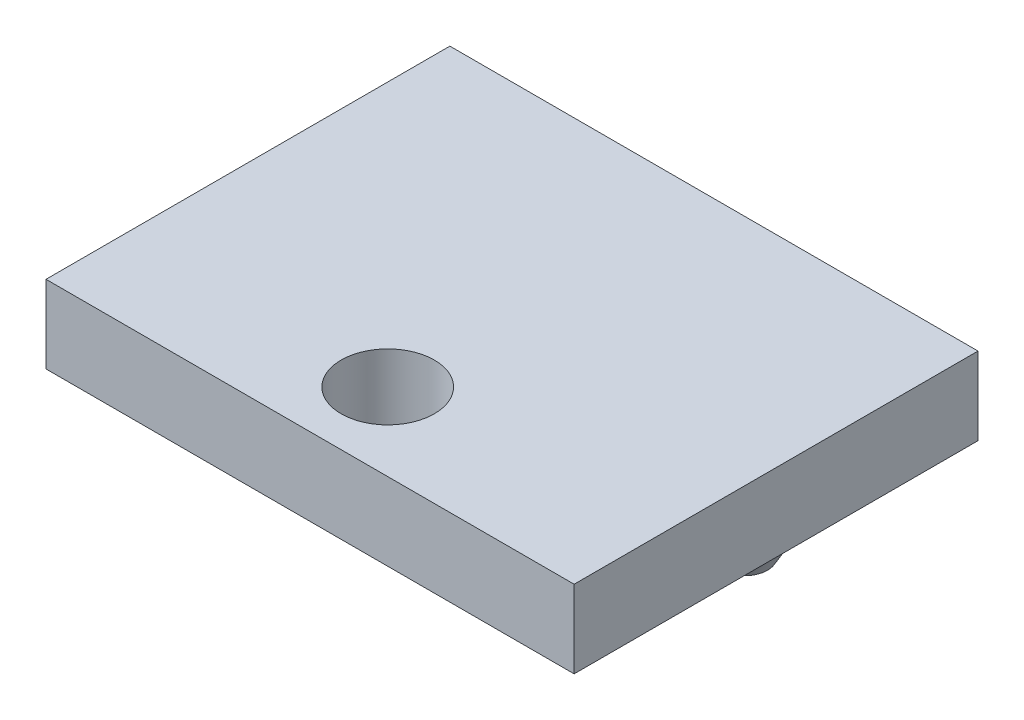
ISO-10303-21;
HEADER;
FILE_DESCRIPTION(('STEP AP214'),'2;1');
FILE_NAME('part.step','',(''),(''),'','','');
FILE_SCHEMA(('AUTOMOTIVE_DESIGN { 1 0 10303 214 1 1 1 1 }'));
ENDSEC;
DATA;
#1=APPLICATION_CONTEXT('core data for automotive mechanical design processes');
#2=APPLICATION_PROTOCOL_DEFINITION('international standard','automotive_design',2000,#1);
#3=PRODUCT_CONTEXT('',#1,'mechanical');
#4=PRODUCT('Part','Part','',(#3));
#5=PRODUCT_RELATED_PRODUCT_CATEGORY('part','',(#4));
#6=PRODUCT_DEFINITION_FORMATION('','',#4);
#7=PRODUCT_DEFINITION_CONTEXT('part definition',#1,'design');
#8=PRODUCT_DEFINITION('design','',#6,#7);
#9=PRODUCT_DEFINITION_SHAPE('','',#8);
#10=(LENGTH_UNIT() NAMED_UNIT(*) SI_UNIT(.MILLI.,.METRE.));
#11=(NAMED_UNIT(*) PLANE_ANGLE_UNIT() SI_UNIT($,.RADIAN.));
#12=(NAMED_UNIT(*) SI_UNIT($,.STERADIAN.) SOLID_ANGLE_UNIT());
#13=UNCERTAINTY_MEASURE_WITH_UNIT(LENGTH_MEASURE(1.E-05),#10,'distance_accuracy_value','');
#14=(GEOMETRIC_REPRESENTATION_CONTEXT(3) GLOBAL_UNCERTAINTY_ASSIGNED_CONTEXT((#13)) GLOBAL_UNIT_ASSIGNED_CONTEXT((#10,
#11,#12)) REPRESENTATION_CONTEXT('',''));
#15=CARTESIAN_POINT('',(0.,0.,0.));
#16=DIRECTION('',(0.,0.,1.));
#17=DIRECTION('',(1.,0.,0.));
#18=AXIS2_PLACEMENT_3D('',#15,#16,#17);
#19=CARTESIAN_POINT('',(-10.,-6.,0.));
#20=DIRECTION('',(0.,1.,0.));
#21=DIRECTION('',(0.,0.,1.));
#22=AXIS2_PLACEMENT_3D('',#19,#20,#21);
#23=CYLINDRICAL_SURFACE('',#22,2.45);
#24=CARTESIAN_POINT('',(-10.,-4.26794919243112,0.));
#25=DIRECTION('',(0.,1.,0.));
#26=DIRECTION('',(0.,0.,1.));
#27=AXIS2_PLACEMENT_3D('',#24,#25,#26);
#28=CIRCLE('',#27,2.45);
#29=CARTESIAN_POINT('',(-10.,-4.26794919243112,2.45));
#30=VERTEX_POINT('',#29);
#31=EDGE_CURVE('E54',#30,#30,#28,.T.);
#32=ORIENTED_EDGE('',*,*,#31,.T.);
#33=EDGE_LOOP('',(#32));
#34=FACE_BOUND('',#33,.T.);
#35=CARTESIAN_POINT('',(-10.,0.,0.));
#36=DIRECTION('',(0.,1.,0.));
#37=DIRECTION('',(0.,0.,1.));
#38=AXIS2_PLACEMENT_3D('',#35,#36,#37);
#39=CIRCLE('',#38,2.45);
#40=CARTESIAN_POINT('',(-10.,0.,2.45));
#41=VERTEX_POINT('',#40);
#42=EDGE_CURVE('E134',#41,#41,#39,.T.);
#43=ORIENTED_EDGE('',*,*,#42,.F.);
#44=EDGE_LOOP('',(#43));
#45=FACE_BOUND('',#44,.T.);
#46=ADVANCED_FACE('F43',(#34,#45),#23,.T.);
#47=CARTESIAN_POINT('',(0.,-6.,0.));
#48=DIRECTION('',(0.,1.,0.));
#49=DIRECTION('',(0.,0.,1.));
#50=AXIS2_PLACEMENT_3D('',#47,#48,#49);
#51=PLANE('',#50);
#52=CARTESIAN_POINT('',(-10.,-6.,0.));
#53=DIRECTION('',(0.,1.,0.));
#54=DIRECTION('',(0.,0.,1.));
#55=AXIS2_PLACEMENT_3D('',#52,#53,#54);
#56=CIRCLE('',#55,1.45);
#57=CARTESIAN_POINT('',(-10.,-6.,1.45));
#58=VERTEX_POINT('',#57);
#59=EDGE_CURVE('E11',#58,#58,#56,.F.);
#60=ORIENTED_EDGE('',*,*,#59,.T.);
#61=EDGE_LOOP('',(#60));
#62=FACE_BOUND('',#61,.T.);
#63=ADVANCED_FACE('F145',(#62),#51,.F.);
#64=CARTESIAN_POINT('',(-10.,-4.26794919243112,0.));
#65=DIRECTION('',(0.,1.,0.));
#66=DIRECTION('',(0.,0.,1.));
#67=AXIS2_PLACEMENT_3D('',#64,#65,#66);
#68=CONICAL_SURFACE('',#67,2.45,0.5235987755983);
#69=ORIENTED_EDGE('',*,*,#59,.F.);
#70=EDGE_LOOP('',(#69));
#71=FACE_BOUND('',#70,.T.);
#72=ORIENTED_EDGE('',*,*,#31,.F.);
#73=EDGE_LOOP('',(#72));
#74=FACE_BOUND('',#73,.T.);
#75=ADVANCED_FACE('F46',(#71,#74),#68,.T.);
#76=CARTESIAN_POINT('',(17.,5.,-8.));
#77=DIRECTION('',(-1.,0.,0.));
#78=DIRECTION('',(0.,0.,1.));
#79=AXIS2_PLACEMENT_3D('',#76,#77,#78);
#80=PLANE('',#79);
#81=DIRECTION('',(0.,0.,-1.));
#82=VECTOR('',#81,1.);
#83=CARTESIAN_POINT('',(17.,0.,-8.));
#84=LINE('',#83,#82);
#85=CARTESIAN_POINT('',(17.,0.,18.));
#86=VERTEX_POINT('',#85);
#87=CARTESIAN_POINT('',(17.,0.,-8.));
#88=VERTEX_POINT('',#87);
#89=EDGE_CURVE('E117',#86,#88,#84,.T.);
#90=ORIENTED_EDGE('',*,*,#89,.T.);
#91=DIRECTION('',(0.,-1.,0.));
#92=VECTOR('',#91,1.);
#93=CARTESIAN_POINT('',(17.,5.,-8.));
#94=LINE('',#93,#92);
#95=CARTESIAN_POINT('',(17.,5.,-8.));
#96=VERTEX_POINT('',#95);
#97=EDGE_CURVE('E106',#96,#88,#94,.T.);
#98=ORIENTED_EDGE('',*,*,#97,.F.);
#99=DIRECTION('',(0.,0.,-1.));
#100=VECTOR('',#99,1.);
#101=CARTESIAN_POINT('',(17.,5.,-8.));
#102=LINE('',#101,#100);
#103=CARTESIAN_POINT('',(17.,5.,18.));
#104=VERTEX_POINT('',#103);
#105=EDGE_CURVE('E98',#104,#96,#102,.T.);
#106=ORIENTED_EDGE('',*,*,#105,.F.);
#107=DIRECTION('',(0.,-1.,0.));
#108=VECTOR('',#107,1.);
#109=CARTESIAN_POINT('',(17.,5.,18.));
#110=LINE('',#109,#108);
#111=EDGE_CURVE('E113',#104,#86,#110,.T.);
#112=ORIENTED_EDGE('',*,*,#111,.T.);
#113=EDGE_LOOP('',(#90,#98,#106,#112));
#114=FACE_BOUND('',#113,.T.);
#115=ADVANCED_FACE('F144',(#114),#80,.F.);
#116=CARTESIAN_POINT('',(-17.,5.,-8.));
#117=DIRECTION('',(0.,0.,1.));
#118=DIRECTION('',(1.,0.,0.));
#119=AXIS2_PLACEMENT_3D('',#116,#117,#118);
#120=PLANE('',#119);
#121=DIRECTION('',(-1.,0.,0.));
#122=VECTOR('',#121,1.);
#123=CARTESIAN_POINT('',(-17.,0.,-8.));
#124=LINE('',#123,#122);
#125=CARTESIAN_POINT('',(-17.,0.,-8.));
#126=VERTEX_POINT('',#125);
#127=EDGE_CURVE('E104',#88,#126,#124,.T.);
#128=ORIENTED_EDGE('',*,*,#127,.T.);
#129=DIRECTION('',(0.,-1.,0.));
#130=VECTOR('',#129,1.);
#131=CARTESIAN_POINT('',(-17.,5.,-8.));
#132=LINE('',#131,#130);
#133=CARTESIAN_POINT('',(-17.,5.,-8.));
#134=VERTEX_POINT('',#133);
#135=EDGE_CURVE('E102',#134,#126,#132,.T.);
#136=ORIENTED_EDGE('',*,*,#135,.F.);
#137=DIRECTION('',(-1.,0.,0.));
#138=VECTOR('',#137,1.);
#139=CARTESIAN_POINT('',(-17.,5.,-8.));
#140=LINE('',#139,#138);
#141=EDGE_CURVE('E93',#96,#134,#140,.T.);
#142=ORIENTED_EDGE('',*,*,#141,.F.);
#143=ORIENTED_EDGE('',*,*,#97,.T.);
#144=EDGE_LOOP('',(#128,#136,#142,#143));
#145=FACE_BOUND('',#144,.T.);
#146=ADVANCED_FACE('F103',(#145),#120,.F.);
#147=CARTESIAN_POINT('',(-17.,5.,-8.));
#148=DIRECTION('',(1.,0.,0.));
#149=DIRECTION('',(0.,0.,-1.));
#150=AXIS2_PLACEMENT_3D('',#147,#148,#149);
#151=PLANE('',#150);
#152=DIRECTION('',(0.,0.,1.));
#153=VECTOR('',#152,1.);
#154=CARTESIAN_POINT('',(-17.,0.,-8.));
#155=LINE('',#154,#153);
#156=CARTESIAN_POINT('',(-17.,0.,18.));
#157=VERTEX_POINT('',#156);
#158=EDGE_CURVE('E79',#126,#157,#155,.T.);
#159=ORIENTED_EDGE('',*,*,#158,.T.);
#160=DIRECTION('',(0.,-1.,0.));
#161=VECTOR('',#160,1.);
#162=CARTESIAN_POINT('',(-17.,5.,18.));
#163=LINE('',#162,#161);
#164=CARTESIAN_POINT('',(-17.,5.,18.));
#165=VERTEX_POINT('',#164);
#166=EDGE_CURVE('E107',#165,#157,#163,.T.);
#167=ORIENTED_EDGE('',*,*,#166,.F.);
#168=DIRECTION('',(0.,0.,1.));
#169=VECTOR('',#168,1.);
#170=CARTESIAN_POINT('',(-17.,5.,-8.));
#171=LINE('',#170,#169);
#172=EDGE_CURVE('E96',#134,#165,#171,.T.);
#173=ORIENTED_EDGE('',*,*,#172,.F.);
#174=ORIENTED_EDGE('',*,*,#135,.T.);
#175=EDGE_LOOP('',(#159,#167,#173,#174));
#176=FACE_BOUND('',#175,.T.);
#177=ADVANCED_FACE('F109',(#176),#151,.F.);
#178=CARTESIAN_POINT('',(-17.,5.,18.));
#179=DIRECTION('',(0.,0.,-1.));
#180=DIRECTION('',(-1.,0.,0.));
#181=AXIS2_PLACEMENT_3D('',#178,#179,#180);
#182=PLANE('',#181);
#183=DIRECTION('',(1.,0.,0.));
#184=VECTOR('',#183,1.);
#185=CARTESIAN_POINT('',(-17.,0.,18.));
#186=LINE('',#185,#184);
#187=EDGE_CURVE('E85',#157,#86,#186,.T.);
#188=ORIENTED_EDGE('',*,*,#187,.T.);
#189=ORIENTED_EDGE('',*,*,#111,.F.);
#190=DIRECTION('',(1.,0.,0.));
#191=VECTOR('',#190,1.);
#192=CARTESIAN_POINT('',(-17.,5.,18.));
#193=LINE('',#192,#191);
#194=EDGE_CURVE('E62',#165,#104,#193,.T.);
#195=ORIENTED_EDGE('',*,*,#194,.F.);
#196=ORIENTED_EDGE('',*,*,#166,.T.);
#197=EDGE_LOOP('',(#188,#189,#195,#196));
#198=FACE_BOUND('',#197,.T.);
#199=ADVANCED_FACE('F164',(#198),#182,.F.);
#200=CARTESIAN_POINT('',(0.,5.,0.));
#201=DIRECTION('',(0.,1.,0.));
#202=DIRECTION('',(0.,0.,1.));
#203=AXIS2_PLACEMENT_3D('',#200,#201,#202);
#204=PLANE('',#203);
#205=CARTESIAN_POINT('',(0.,5.,13.));
#206=DIRECTION('',(0.,-1.,0.));
#207=DIRECTION('',(0.,0.,-1.));
#208=AXIS2_PLACEMENT_3D('',#205,#206,#207);
#209=CIRCLE('',#208,3.);
#210=CARTESIAN_POINT('',(0.,5.,10.));
#211=VERTEX_POINT('',#210);
#212=EDGE_CURVE('E197',#211,#211,#209,.T.);
#213=ORIENTED_EDGE('',*,*,#212,.T.);
#214=EDGE_LOOP('',(#213));
#215=FACE_BOUND('',#214,.T.);
#216=ORIENTED_EDGE('',*,*,#105,.T.);
#217=ORIENTED_EDGE('',*,*,#141,.T.);
#218=ORIENTED_EDGE('',*,*,#172,.T.);
#219=ORIENTED_EDGE('',*,*,#194,.T.);
#220=EDGE_LOOP('',(#216,#217,#218,#219));
#221=FACE_BOUND('',#220,.T.);
#222=ADVANCED_FACE('F94',(#215,#221),#204,.T.);
#223=CARTESIAN_POINT('',(0.,0.,0.));
#224=DIRECTION('',(0.,1.,0.));
#225=DIRECTION('',(0.,0.,1.));
#226=AXIS2_PLACEMENT_3D('',#223,#224,#225);
#227=PLANE('',#226);
#228=CARTESIAN_POINT('',(0.,0.,13.));
#229=DIRECTION('',(0.,-1.,0.));
#230=DIRECTION('',(0.,0.,-1.));
#231=AXIS2_PLACEMENT_3D('',#228,#229,#230);
#232=CIRCLE('',#231,3.);
#233=CARTESIAN_POINT('',(0.,0.,10.));
#234=VERTEX_POINT('',#233);
#235=EDGE_CURVE('E200',#234,#234,#232,.T.);
#236=ORIENTED_EDGE('',*,*,#235,.F.);
#237=EDGE_LOOP('',(#236));
#238=FACE_BOUND('',#237,.T.);
#239=CARTESIAN_POINT('',(10.,0.,0.));
#240=DIRECTION('',(0.,1.,0.));
#241=DIRECTION('',(0.,0.,1.));
#242=AXIS2_PLACEMENT_3D('',#239,#240,#241);
#243=CIRCLE('',#242,2.45);
#244=CARTESIAN_POINT('',(10.,0.,2.45));
#245=VERTEX_POINT('',#244);
#246=EDGE_CURVE('E204',#245,#245,#243,.T.);
#247=ORIENTED_EDGE('',*,*,#246,.T.);
#248=EDGE_LOOP('',(#247));
#249=FACE_BOUND('',#248,.T.);
#250=ORIENTED_EDGE('',*,*,#42,.T.);
#251=EDGE_LOOP('',(#250));
#252=FACE_BOUND('',#251,.T.);
#253=ORIENTED_EDGE('',*,*,#89,.F.);
#254=ORIENTED_EDGE('',*,*,#187,.F.);
#255=ORIENTED_EDGE('',*,*,#158,.F.);
#256=ORIENTED_EDGE('',*,*,#127,.F.);
#257=EDGE_LOOP('',(#253,#254,#255,#256));
#258=FACE_BOUND('',#257,.T.);
#259=ADVANCED_FACE('F167',(#238,#249,#252,#258),#227,.F.);
#260=CARTESIAN_POINT('',(10.,-6.,0.));
#261=DIRECTION('',(0.,1.,0.));
#262=DIRECTION('',(0.,0.,1.));
#263=AXIS2_PLACEMENT_3D('',#260,#261,#262);
#264=CYLINDRICAL_SURFACE('',#263,2.45);
#265=CARTESIAN_POINT('',(10.,-4.26794919243112,0.));
#266=DIRECTION('',(0.,1.,0.));
#267=DIRECTION('',(0.,0.,1.));
#268=AXIS2_PLACEMENT_3D('',#265,#266,#267);
#269=CIRCLE('',#268,2.45);
#270=CARTESIAN_POINT('',(10.,-4.26794919243112,2.45));
#271=VERTEX_POINT('',#270);
#272=EDGE_CURVE('E210',#271,#271,#269,.T.);
#273=ORIENTED_EDGE('',*,*,#272,.T.);
#274=EDGE_LOOP('',(#273));
#275=FACE_BOUND('',#274,.T.);
#276=ORIENTED_EDGE('',*,*,#246,.F.);
#277=EDGE_LOOP('',(#276));
#278=FACE_BOUND('',#277,.T.);
#279=ADVANCED_FACE('F170',(#275,#278),#264,.T.);
#280=CARTESIAN_POINT('',(0.,-6.,0.));
#281=DIRECTION('',(0.,1.,0.));
#282=DIRECTION('',(0.,0.,1.));
#283=AXIS2_PLACEMENT_3D('',#280,#281,#282);
#284=PLANE('',#283);
#285=CARTESIAN_POINT('',(10.,-6.,0.));
#286=DIRECTION('',(0.,1.,0.));
#287=DIRECTION('',(0.,0.,1.));
#288=AXIS2_PLACEMENT_3D('',#285,#286,#287);
#289=CIRCLE('',#288,1.45);
#290=CARTESIAN_POINT('',(10.,-6.,1.44999999999999));
#291=VERTEX_POINT('',#290);
#292=EDGE_CURVE('E121',#291,#291,#289,.F.);
#293=ORIENTED_EDGE('',*,*,#292,.T.);
#294=EDGE_LOOP('',(#293));
#295=FACE_BOUND('',#294,.T.);
#296=ADVANCED_FACE('F182',(#295),#284,.F.);
#297=CARTESIAN_POINT('',(10.,-4.26794919243112,0.));
#298=DIRECTION('',(0.,1.,0.));
#299=DIRECTION('',(0.,0.,1.));
#300=AXIS2_PLACEMENT_3D('',#297,#298,#299);
#301=CONICAL_SURFACE('',#300,2.45,0.5235987755983);
#302=ORIENTED_EDGE('',*,*,#292,.F.);
#303=EDGE_LOOP('',(#302));
#304=FACE_BOUND('',#303,.T.);
#305=ORIENTED_EDGE('',*,*,#272,.F.);
#306=EDGE_LOOP('',(#305));
#307=FACE_BOUND('',#306,.T.);
#308=ADVANCED_FACE('F176',(#304,#307),#301,.T.);
#309=CARTESIAN_POINT('',(0.,5.,13.));
#310=DIRECTION('',(0.,-1.,0.));
#311=DIRECTION('',(0.,0.,-1.));
#312=AXIS2_PLACEMENT_3D('',#309,#310,#311);
#313=CYLINDRICAL_SURFACE('',#312,3.);
#314=ORIENTED_EDGE('',*,*,#212,.F.);
#315=EDGE_LOOP('',(#314));
#316=FACE_BOUND('',#315,.T.);
#317=ORIENTED_EDGE('',*,*,#235,.T.);
#318=EDGE_LOOP('',(#317));
#319=FACE_BOUND('',#318,.T.);
#320=ADVANCED_FACE('F181',(#316,#319),#313,.F.);
#321=CLOSED_SHELL('',(#46,#63,#75,#115,#146,#177,#199,#222,#259,#279,#296,#308,#320));
#322=MANIFOLD_SOLID_BREP('B2',#321);
#323=ADVANCED_BREP_SHAPE_REPRESENTATION('',(#18,#322),#14);
#324=SHAPE_DEFINITION_REPRESENTATION(#9,#323);
ENDSEC;
END-ISO-10303-21;
